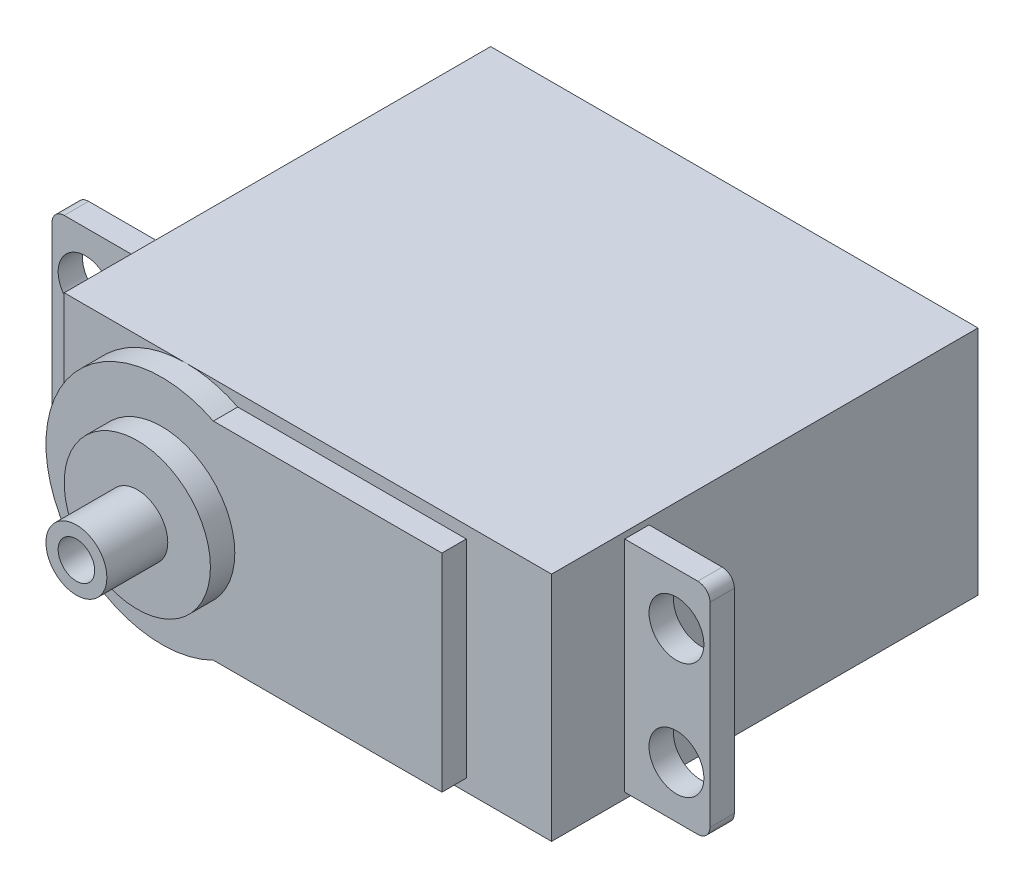
ISO-10303-21;
HEADER;
FILE_DESCRIPTION(('STEP AP214'),'2;1');
FILE_NAME('part.step','',(''),(''),'','','');
FILE_SCHEMA(('AUTOMOTIVE_DESIGN { 1 0 10303 214 1 1 1 1 }'));
ENDSEC;
DATA;
#1=APPLICATION_CONTEXT('core data for automotive mechanical design processes');
#2=APPLICATION_PROTOCOL_DEFINITION('international standard','automotive_design',2000,#1);
#3=PRODUCT_CONTEXT('',#1,'mechanical');
#4=PRODUCT('Part','Part','',(#3));
#5=PRODUCT_RELATED_PRODUCT_CATEGORY('part','',(#4));
#6=PRODUCT_DEFINITION_FORMATION('','',#4);
#7=PRODUCT_DEFINITION_CONTEXT('part definition',#1,'design');
#8=PRODUCT_DEFINITION('design','',#6,#7);
#9=PRODUCT_DEFINITION_SHAPE('','',#8);
#10=(LENGTH_UNIT() NAMED_UNIT(*) SI_UNIT(.MILLI.,.METRE.));
#11=(NAMED_UNIT(*) PLANE_ANGLE_UNIT() SI_UNIT($,.RADIAN.));
#12=(NAMED_UNIT(*) SI_UNIT($,.STERADIAN.) SOLID_ANGLE_UNIT());
#13=UNCERTAINTY_MEASURE_WITH_UNIT(LENGTH_MEASURE(1.E-05),#10,'distance_accuracy_value','');
#14=(GEOMETRIC_REPRESENTATION_CONTEXT(3) GLOBAL_UNCERTAINTY_ASSIGNED_CONTEXT((#13)) GLOBAL_UNIT_ASSIGNED_CONTEXT((#10,
#11,#12)) REPRESENTATION_CONTEXT('',''));
#15=CARTESIAN_POINT('',(0.,0.,0.));
#16=DIRECTION('',(0.,0.,1.));
#17=DIRECTION('',(1.,0.,0.));
#18=AXIS2_PLACEMENT_3D('',#15,#16,#17);
#19=CARTESIAN_POINT('',(-30.,9.50000000000001,39.));
#20=DIRECTION('',(0.,0.,-1.));
#21=DIRECTION('',(-1.,0.,0.));
#22=AXIS2_PLACEMENT_3D('',#19,#20,#21);
#23=PLANE('',#22);
#24=CARTESIAN_POINT('',(-30.,9.50000000000001,39.));
#25=DIRECTION('',(0.,0.,1.));
#26=DIRECTION('',(1.,0.,0.));
#27=AXIS2_PLACEMENT_3D('',#24,#25,#26);
#28=CIRCLE('',#27,6.);
#29=CARTESIAN_POINT('',(-24.,9.50000000000001,39.));
#30=VERTEX_POINT('',#29);
#31=EDGE_CURVE('P0_E20',#30,#30,#28,.F.);
#32=ORIENTED_EDGE('',*,*,#31,.F.);
#33=EDGE_LOOP('',(#32));
#34=FACE_BOUND('',#33,.T.);
#35=ADVANCED_FACE('P0_F17',(#34),#23,.F.);
#36=CARTESIAN_POINT('',(-30.,9.50000000000001,37.));
#37=DIRECTION('',(0.,0.,1.));
#38=DIRECTION('',(1.,0.,0.));
#39=AXIS2_PLACEMENT_3D('',#36,#37,#38);
#40=CYLINDRICAL_SURFACE('',#39,6.);
#41=CARTESIAN_POINT('',(-30.,9.50000000000001,37.));
#42=DIRECTION('',(0.,0.,1.));
#43=DIRECTION('',(1.,0.,0.));
#44=AXIS2_PLACEMENT_3D('',#41,#42,#43);
#45=CIRCLE('',#44,6.);
#46=CARTESIAN_POINT('',(-24.,9.50000000000001,37.));
#47=VERTEX_POINT('',#46);
#48=EDGE_CURVE('P0_E168',#47,#47,#45,.T.);
#49=ORIENTED_EDGE('',*,*,#48,.T.);
#50=EDGE_LOOP('',(#49));
#51=FACE_BOUND('',#50,.T.);
#52=ORIENTED_EDGE('',*,*,#31,.T.);
#53=EDGE_LOOP('',(#52));
#54=FACE_BOUND('',#53,.T.);
#55=ADVANCED_FACE('P0_F383',(#51,#54),#40,.T.);
#56=CARTESIAN_POINT('',(-30.,9.50000000000001,37.));
#57=DIRECTION('',(0.,0.,-1.));
#58=DIRECTION('',(-1.,0.,0.));
#59=AXIS2_PLACEMENT_3D('',#56,#57,#58);
#60=PLANE('',#59);
#61=ORIENTED_EDGE('',*,*,#48,.F.);
#62=EDGE_LOOP('',(#61));
#63=FACE_BOUND('',#62,.T.);
#64=DIRECTION('',(0.,1.,0.));
#65=VECTOR('',#64,1.);
#66=CARTESIAN_POINT('',(-7.00000000000001,18.,37.));
#67=LINE('',#66,#65);
#68=CARTESIAN_POINT('',(-7.00000000000001,18.,37.));
#69=VERTEX_POINT('',#68);
#70=CARTESIAN_POINT('',(-7.,1.,37.));
#71=VERTEX_POINT('',#70);
#72=EDGE_CURVE('P0_E227',#69,#71,#67,.F.);
#73=ORIENTED_EDGE('',*,*,#72,.F.);
#74=DIRECTION('',(-1.,0.,0.));
#75=VECTOR('',#74,1.);
#76=CARTESIAN_POINT('',(-30.,18.,37.));
#77=LINE('',#76,#75);
#78=CARTESIAN_POINT('',(-25.7573593128807,18.,37.));
#79=VERTEX_POINT('',#78);
#80=EDGE_CURVE('P0_E321',#79,#69,#77,.F.);
#81=ORIENTED_EDGE('',*,*,#80,.F.);
#82=CARTESIAN_POINT('',(-30.,9.50000000000001,37.));
#83=DIRECTION('',(0.,0.,1.));
#84=DIRECTION('',(1.,0.,0.));
#85=AXIS2_PLACEMENT_3D('',#82,#83,#84);
#86=CIRCLE('',#85,9.49999999999999);
#87=CARTESIAN_POINT('',(-25.7573593128808,0.999999999999986,37.));
#88=VERTEX_POINT('',#87);
#89=EDGE_CURVE('P0_E222',#88,#79,#86,.F.);
#90=ORIENTED_EDGE('',*,*,#89,.F.);
#91=DIRECTION('',(1.,0.,0.));
#92=VECTOR('',#91,1.);
#93=CARTESIAN_POINT('',(-7.,1.,37.));
#94=LINE('',#93,#92);
#95=EDGE_CURVE('P0_E277',#71,#88,#94,.F.);
#96=ORIENTED_EDGE('',*,*,#95,.F.);
#97=EDGE_LOOP('',(#73,#81,#90,#96));
#98=FACE_BOUND('',#97,.T.);
#99=ADVANCED_FACE('P0_F390',(#63,#98),#60,.F.);
#100=CARTESIAN_POINT('',(-46.,1.5,28.5));
#101=DIRECTION('',(0.,0.,-1.));
#102=DIRECTION('',(-1.,0.,0.));
#103=AXIS2_PLACEMENT_3D('',#100,#101,#102);
#104=CYLINDRICAL_SURFACE('',#103,1.);
#105=CARTESIAN_POINT('',(-46.,1.5,29.));
#106=DIRECTION('',(0.,0.,-1.));
#107=DIRECTION('',(-1.,0.,0.));
#108=AXIS2_PLACEMENT_3D('',#105,#106,#107);
#109=CIRCLE('',#108,1.);
#110=CARTESIAN_POINT('',(-47.,1.5,29.));
#111=VERTEX_POINT('',#110);
#112=CARTESIAN_POINT('',(-46.,0.499999999999996,29.));
#113=VERTEX_POINT('',#112);
#114=EDGE_CURVE('P0_E197',#111,#113,#109,.F.);
#115=ORIENTED_EDGE('',*,*,#114,.F.);
#116=DIRECTION('',(0.,0.,-1.));
#117=VECTOR('',#116,1.);
#118=CARTESIAN_POINT('',(-47.,1.5,28.));
#119=LINE('',#118,#117);
#120=CARTESIAN_POINT('',(-47.,1.5,27.));
#121=VERTEX_POINT('',#120);
#122=EDGE_CURVE('P0_E166',#111,#121,#119,.T.);
#123=ORIENTED_EDGE('',*,*,#122,.T.);
#124=CARTESIAN_POINT('',(-46.,1.5,27.));
#125=DIRECTION('',(0.,0.,-1.));
#126=DIRECTION('',(-1.,0.,0.));
#127=AXIS2_PLACEMENT_3D('',#124,#125,#126);
#128=CIRCLE('',#127,1.);
#129=CARTESIAN_POINT('',(-46.,0.499999999999996,27.));
#130=VERTEX_POINT('',#129);
#131=EDGE_CURVE('P0_E158',#121,#130,#128,.F.);
#132=ORIENTED_EDGE('',*,*,#131,.T.);
#133=DIRECTION('',(0.,0.,-1.));
#134=VECTOR('',#133,1.);
#135=CARTESIAN_POINT('',(-46.,0.499999999999996,29.));
#136=LINE('',#135,#134);
#137=EDGE_CURVE('P0_E164',#113,#130,#136,.T.);
#138=ORIENTED_EDGE('',*,*,#137,.F.);
#139=EDGE_LOOP('',(#115,#123,#132,#138));
#140=FACE_BOUND('',#139,.T.);
#141=ADVANCED_FACE('P0_F163',(#140),#104,.T.);
#142=CARTESIAN_POINT('',(-47.,9.5,28.));
#143=DIRECTION('',(1.,0.,0.));
#144=DIRECTION('',(0.,0.,-1.));
#145=AXIS2_PLACEMENT_3D('',#142,#143,#144);
#146=PLANE('',#145);
#147=DIRECTION('',(0.,1.,0.));
#148=VECTOR('',#147,1.);
#149=CARTESIAN_POINT('',(-47.,0.499999999999996,27.));
#150=LINE('',#149,#148);
#151=CARTESIAN_POINT('',(-47.,17.5,27.));
#152=VERTEX_POINT('',#151);
#153=EDGE_CURVE('P0_E183',#121,#152,#150,.T.);
#154=ORIENTED_EDGE('',*,*,#153,.F.);
#155=ORIENTED_EDGE('',*,*,#122,.F.);
#156=DIRECTION('',(0.,1.,0.));
#157=VECTOR('',#156,1.);
#158=CARTESIAN_POINT('',(-47.,18.5,29.));
#159=LINE('',#158,#157);
#160=CARTESIAN_POINT('',(-47.,17.5,29.));
#161=VERTEX_POINT('',#160);
#162=EDGE_CURVE('P0_E194',#161,#111,#159,.F.);
#163=ORIENTED_EDGE('',*,*,#162,.F.);
#164=DIRECTION('',(0.,0.,1.));
#165=VECTOR('',#164,1.);
#166=CARTESIAN_POINT('',(-47.,17.5,27.5));
#167=LINE('',#166,#165);
#168=EDGE_CURVE('P0_E312',#152,#161,#167,.T.);
#169=ORIENTED_EDGE('',*,*,#168,.F.);
#170=EDGE_LOOP('',(#154,#155,#163,#169));
#171=FACE_BOUND('',#170,.T.);
#172=ADVANCED_FACE('P0_F498',(#171),#146,.F.);
#173=CARTESIAN_POINT('',(-44.25,14.25,29.));
#174=DIRECTION('',(0.,0.,-1.));
#175=DIRECTION('',(-1.,0.,0.));
#176=AXIS2_PLACEMENT_3D('',#173,#174,#175);
#177=CYLINDRICAL_SURFACE('',#176,2.25);
#178=CARTESIAN_POINT('',(-44.25,14.25,29.));
#179=DIRECTION('',(0.,0.,-1.));
#180=DIRECTION('',(-1.,0.,0.));
#181=AXIS2_PLACEMENT_3D('',#178,#179,#180);
#182=CIRCLE('',#181,2.25);
#183=CARTESIAN_POINT('',(-46.5,14.25,29.));
#184=VERTEX_POINT('',#183);
#185=EDGE_CURVE('P0_E369',#184,#184,#182,.T.);
#186=ORIENTED_EDGE('',*,*,#185,.F.);
#187=EDGE_LOOP('',(#186));
#188=FACE_BOUND('',#187,.T.);
#189=CARTESIAN_POINT('',(-44.25,14.25,27.));
#190=DIRECTION('',(0.,0.,-1.));
#191=DIRECTION('',(-1.,0.,0.));
#192=AXIS2_PLACEMENT_3D('',#189,#190,#191);
#193=CIRCLE('',#192,2.25);
#194=CARTESIAN_POINT('',(-46.5,14.25,27.));
#195=VERTEX_POINT('',#194);
#196=EDGE_CURVE('P0_E186',#195,#195,#193,.F.);
#197=ORIENTED_EDGE('',*,*,#196,.F.);
#198=EDGE_LOOP('',(#197));
#199=FACE_BOUND('',#198,.T.);
#200=ADVANCED_FACE('P0_F494',(#188,#199),#177,.F.);
#201=CARTESIAN_POINT('',(-44.25,4.75,29.));
#202=DIRECTION('',(0.,0.,-1.));
#203=DIRECTION('',(-1.,0.,0.));
#204=AXIS2_PLACEMENT_3D('',#201,#202,#203);
#205=CYLINDRICAL_SURFACE('',#204,2.25);
#206=CARTESIAN_POINT('',(-44.25,4.75,29.));
#207=DIRECTION('',(0.,0.,-1.));
#208=DIRECTION('',(-1.,0.,0.));
#209=AXIS2_PLACEMENT_3D('',#206,#207,#208);
#210=CIRCLE('',#209,2.25);
#211=CARTESIAN_POINT('',(-46.5,4.75,29.));
#212=VERTEX_POINT('',#211);
#213=EDGE_CURVE('P0_E177',#212,#212,#210,.T.);
#214=ORIENTED_EDGE('',*,*,#213,.F.);
#215=EDGE_LOOP('',(#214));
#216=FACE_BOUND('',#215,.T.);
#217=CARTESIAN_POINT('',(-44.25,4.75,27.));
#218=DIRECTION('',(0.,0.,-1.));
#219=DIRECTION('',(-1.,0.,0.));
#220=AXIS2_PLACEMENT_3D('',#217,#218,#219);
#221=CIRCLE('',#220,2.25);
#222=CARTESIAN_POINT('',(-46.5,4.75,27.));
#223=VERTEX_POINT('',#222);
#224=EDGE_CURVE('P0_E287',#223,#223,#221,.F.);
#225=ORIENTED_EDGE('',*,*,#224,.F.);
#226=EDGE_LOOP('',(#225));
#227=FACE_BOUND('',#226,.T.);
#228=ADVANCED_FACE('P0_F490',(#216,#227),#205,.F.);
#229=CARTESIAN_POINT('',(-46.,17.5,27.5));
#230=DIRECTION('',(0.,0.,1.));
#231=DIRECTION('',(1.,0.,0.));
#232=AXIS2_PLACEMENT_3D('',#229,#230,#231);
#233=CYLINDRICAL_SURFACE('',#232,1.);
#234=CARTESIAN_POINT('',(-46.,17.5,27.));
#235=DIRECTION('',(0.,0.,1.));
#236=DIRECTION('',(1.,0.,0.));
#237=AXIS2_PLACEMENT_3D('',#234,#235,#236);
#238=CIRCLE('',#237,1.);
#239=CARTESIAN_POINT('',(-46.,18.5,27.));
#240=VERTEX_POINT('',#239);
#241=EDGE_CURVE('P0_E184',#152,#240,#238,.F.);
#242=ORIENTED_EDGE('',*,*,#241,.F.);
#243=ORIENTED_EDGE('',*,*,#168,.T.);
#244=CARTESIAN_POINT('',(-46.,17.5,29.));
#245=DIRECTION('',(0.,0.,1.));
#246=DIRECTION('',(1.,0.,0.));
#247=AXIS2_PLACEMENT_3D('',#244,#245,#246);
#248=CIRCLE('',#247,1.);
#249=CARTESIAN_POINT('',(-46.,18.5,29.));
#250=VERTEX_POINT('',#249);
#251=EDGE_CURVE('P0_E198',#250,#161,#248,.T.);
#252=ORIENTED_EDGE('',*,*,#251,.F.);
#253=DIRECTION('',(0.,0.,1.));
#254=VECTOR('',#253,1.);
#255=CARTESIAN_POINT('',(-46.,18.5,27.));
#256=LINE('',#255,#254);
#257=EDGE_CURVE('P0_E283',#240,#250,#256,.T.);
#258=ORIENTED_EDGE('',*,*,#257,.F.);
#259=EDGE_LOOP('',(#242,#243,#252,#258));
#260=FACE_BOUND('',#259,.T.);
#261=ADVANCED_FACE('P0_F486',(#260),#233,.T.);
#262=CARTESIAN_POINT('',(5.99999999999999,17.5,28.5));
#263=DIRECTION('',(0.,0.,-1.));
#264=DIRECTION('',(-1.,0.,0.));
#265=AXIS2_PLACEMENT_3D('',#262,#263,#264);
#266=CYLINDRICAL_SURFACE('',#265,1.);
#267=CARTESIAN_POINT('',(5.99999999999999,17.5,29.));
#268=DIRECTION('',(0.,0.,-1.));
#269=DIRECTION('',(-1.,0.,0.));
#270=AXIS2_PLACEMENT_3D('',#267,#268,#269);
#271=CIRCLE('',#270,1.);
#272=CARTESIAN_POINT('',(7.,17.5,29.));
#273=VERTEX_POINT('',#272);
#274=CARTESIAN_POINT('',(5.99999999999999,18.5,29.));
#275=VERTEX_POINT('',#274);
#276=EDGE_CURVE('P0_E357',#273,#275,#271,.F.);
#277=ORIENTED_EDGE('',*,*,#276,.F.);
#278=DIRECTION('',(0.,0.,1.));
#279=VECTOR('',#278,1.);
#280=CARTESIAN_POINT('',(7.,17.5,28.));
#281=LINE('',#280,#279);
#282=CARTESIAN_POINT('',(6.99999999999999,17.5,27.));
#283=VERTEX_POINT('',#282);
#284=EDGE_CURVE('P0_E263',#283,#273,#281,.T.);
#285=ORIENTED_EDGE('',*,*,#284,.F.);
#286=CARTESIAN_POINT('',(5.99999999999999,17.5,27.));
#287=DIRECTION('',(0.,0.,-1.));
#288=DIRECTION('',(-1.,0.,0.));
#289=AXIS2_PLACEMENT_3D('',#286,#287,#288);
#290=CIRCLE('',#289,1.);
#291=CARTESIAN_POINT('',(5.99999999999999,18.5,27.));
#292=VERTEX_POINT('',#291);
#293=EDGE_CURVE('P0_E266',#283,#292,#290,.F.);
#294=ORIENTED_EDGE('',*,*,#293,.T.);
#295=DIRECTION('',(0.,0.,1.));
#296=VECTOR('',#295,1.);
#297=CARTESIAN_POINT('',(5.99999999999999,18.5,29.));
#298=LINE('',#297,#296);
#299=EDGE_CURVE('P0_E267',#275,#292,#298,.F.);
#300=ORIENTED_EDGE('',*,*,#299,.F.);
#301=EDGE_LOOP('',(#277,#285,#294,#300));
#302=FACE_BOUND('',#301,.T.);
#303=ADVANCED_FACE('P0_F482',(#302),#266,.T.);
#304=CARTESIAN_POINT('',(7.,9.50000000000001,28.));
#305=DIRECTION('',(1.,0.,0.));
#306=DIRECTION('',(0.,1.,0.));
#307=AXIS2_PLACEMENT_3D('',#304,#305,#306);
#308=PLANE('',#307);
#309=ORIENTED_EDGE('',*,*,#284,.T.);
#310=DIRECTION('',(0.,1.,0.));
#311=VECTOR('',#310,1.);
#312=CARTESIAN_POINT('',(7.,0.5,29.));
#313=LINE('',#312,#311);
#314=CARTESIAN_POINT('',(7.,1.5,29.));
#315=VERTEX_POINT('',#314);
#316=EDGE_CURVE('P0_E360',#315,#273,#313,.T.);
#317=ORIENTED_EDGE('',*,*,#316,.F.);
#318=DIRECTION('',(0.,0.,1.));
#319=VECTOR('',#318,1.);
#320=CARTESIAN_POINT('',(7.,1.5,27.5));
#321=LINE('',#320,#319);
#322=CARTESIAN_POINT('',(7.,1.5,27.));
#323=VERTEX_POINT('',#322);
#324=EDGE_CURVE('P0_E265',#323,#315,#321,.T.);
#325=ORIENTED_EDGE('',*,*,#324,.F.);
#326=DIRECTION('',(0.,1.,0.));
#327=VECTOR('',#326,1.);
#328=CARTESIAN_POINT('',(6.99999999999999,18.5,27.));
#329=LINE('',#328,#327);
#330=EDGE_CURVE('P0_E348',#283,#323,#329,.F.);
#331=ORIENTED_EDGE('',*,*,#330,.F.);
#332=EDGE_LOOP('',(#309,#317,#325,#331));
#333=FACE_BOUND('',#332,.T.);
#334=ADVANCED_FACE('P0_F478',(#333),#308,.T.);
#335=CARTESIAN_POINT('',(4.24999999999999,14.25,29.));
#336=DIRECTION('',(0.,0.,-1.));
#337=DIRECTION('',(-1.,0.,0.));
#338=AXIS2_PLACEMENT_3D('',#335,#336,#337);
#339=CYLINDRICAL_SURFACE('',#338,2.25);
#340=CARTESIAN_POINT('',(4.24999999999999,14.25,29.));
#341=DIRECTION('',(0.,0.,-1.));
#342=DIRECTION('',(-1.,0.,0.));
#343=AXIS2_PLACEMENT_3D('',#340,#341,#342);
#344=CIRCLE('',#343,2.25);
#345=CARTESIAN_POINT('',(1.99999999999999,14.25,29.));
#346=VERTEX_POINT('',#345);
#347=EDGE_CURVE('P0_E354',#346,#346,#344,.T.);
#348=ORIENTED_EDGE('',*,*,#347,.F.);
#349=EDGE_LOOP('',(#348));
#350=FACE_BOUND('',#349,.T.);
#351=CARTESIAN_POINT('',(4.24999999999999,14.25,27.));
#352=DIRECTION('',(0.,0.,-1.));
#353=DIRECTION('',(-1.,0.,0.));
#354=AXIS2_PLACEMENT_3D('',#351,#352,#353);
#355=CIRCLE('',#354,2.25);
#356=CARTESIAN_POINT('',(1.99999999999999,14.25,27.));
#357=VERTEX_POINT('',#356);
#358=EDGE_CURVE('P0_E345',#357,#357,#355,.F.);
#359=ORIENTED_EDGE('',*,*,#358,.F.);
#360=EDGE_LOOP('',(#359));
#361=FACE_BOUND('',#360,.T.);
#362=ADVANCED_FACE('P0_F474',(#350,#361),#339,.F.);
#363=CARTESIAN_POINT('',(4.25,4.75,29.));
#364=DIRECTION('',(0.,0.,-1.));
#365=DIRECTION('',(-1.,0.,0.));
#366=AXIS2_PLACEMENT_3D('',#363,#364,#365);
#367=CYLINDRICAL_SURFACE('',#366,2.25);
#368=CARTESIAN_POINT('',(4.25,4.75,29.));
#369=DIRECTION('',(0.,0.,-1.));
#370=DIRECTION('',(-1.,0.,0.));
#371=AXIS2_PLACEMENT_3D('',#368,#369,#370);
#372=CIRCLE('',#371,2.25);
#373=CARTESIAN_POINT('',(2.,4.75,29.));
#374=VERTEX_POINT('',#373);
#375=EDGE_CURVE('P0_E271',#374,#374,#372,.T.);
#376=ORIENTED_EDGE('',*,*,#375,.F.);
#377=EDGE_LOOP('',(#376));
#378=FACE_BOUND('',#377,.T.);
#379=CARTESIAN_POINT('',(4.25,4.75,27.));
#380=DIRECTION('',(0.,0.,-1.));
#381=DIRECTION('',(-1.,0.,0.));
#382=AXIS2_PLACEMENT_3D('',#379,#380,#381);
#383=CIRCLE('',#382,2.25);
#384=CARTESIAN_POINT('',(2.,4.75,27.));
#385=VERTEX_POINT('',#384);
#386=EDGE_CURVE('P0_E234',#385,#385,#383,.F.);
#387=ORIENTED_EDGE('',*,*,#386,.F.);
#388=EDGE_LOOP('',(#387));
#389=FACE_BOUND('',#388,.T.);
#390=ADVANCED_FACE('P0_F470',(#378,#389),#367,.F.);
#391=CARTESIAN_POINT('',(6.,1.5,27.5));
#392=DIRECTION('',(0.,0.,1.));
#393=DIRECTION('',(1.,0.,0.));
#394=AXIS2_PLACEMENT_3D('',#391,#392,#393);
#395=CYLINDRICAL_SURFACE('',#394,1.);
#396=CARTESIAN_POINT('',(6.,1.5,27.));
#397=DIRECTION('',(0.,0.,1.));
#398=DIRECTION('',(1.,0.,0.));
#399=AXIS2_PLACEMENT_3D('',#396,#397,#398);
#400=CIRCLE('',#399,1.);
#401=CARTESIAN_POINT('',(6.,0.500000000000003,27.));
#402=VERTEX_POINT('',#401);
#403=EDGE_CURVE('P0_E280',#323,#402,#400,.F.);
#404=ORIENTED_EDGE('',*,*,#403,.F.);
#405=ORIENTED_EDGE('',*,*,#324,.T.);
#406=CARTESIAN_POINT('',(6.,1.5,29.));
#407=DIRECTION('',(0.,0.,1.));
#408=DIRECTION('',(1.,0.,0.));
#409=AXIS2_PLACEMENT_3D('',#406,#407,#408);
#410=CIRCLE('',#409,1.);
#411=CARTESIAN_POINT('',(6.,0.500000000000003,29.));
#412=VERTEX_POINT('',#411);
#413=EDGE_CURVE('P0_E291',#412,#315,#410,.T.);
#414=ORIENTED_EDGE('',*,*,#413,.F.);
#415=DIRECTION('',(0.,0.,1.));
#416=VECTOR('',#415,1.);
#417=CARTESIAN_POINT('',(6.,0.500000000000003,27.));
#418=LINE('',#417,#416);
#419=EDGE_CURVE('P0_E230',#402,#412,#418,.T.);
#420=ORIENTED_EDGE('',*,*,#419,.F.);
#421=EDGE_LOOP('',(#404,#405,#414,#420));
#422=FACE_BOUND('',#421,.T.);
#423=ADVANCED_FACE('P0_F466',(#422),#395,.T.);
#424=CARTESIAN_POINT('',(-7.,1.,35.));
#425=DIRECTION('',(0.,-1.,0.));
#426=DIRECTION('',(1.,0.,0.));
#427=AXIS2_PLACEMENT_3D('',#424,#425,#426);
#428=PLANE('',#427);
#429=DIRECTION('',(0.,0.,1.));
#430=VECTOR('',#429,1.);
#431=CARTESIAN_POINT('',(-7.,1.,35.));
#432=LINE('',#431,#430);
#433=CARTESIAN_POINT('',(-7.00000000000001,1.,35.));
#434=VERTEX_POINT('',#433);
#435=EDGE_CURVE('P0_E217',#71,#434,#432,.F.);
#436=ORIENTED_EDGE('',*,*,#435,.F.);
#437=ORIENTED_EDGE('',*,*,#95,.T.);
#438=DIRECTION('',(0.,0.,1.));
#439=VECTOR('',#438,1.);
#440=CARTESIAN_POINT('',(-25.7573593128808,0.999999999999982,35.));
#441=LINE('',#440,#439);
#442=CARTESIAN_POINT('',(-25.7573593128808,0.99999999999999,35.));
#443=VERTEX_POINT('',#442);
#444=EDGE_CURVE('P0_E216',#443,#88,#441,.T.);
#445=ORIENTED_EDGE('',*,*,#444,.F.);
#446=DIRECTION('',(1.,0.,0.));
#447=VECTOR('',#446,1.);
#448=CARTESIAN_POINT('',(-20.,0.999999999999999,35.));
#449=LINE('',#448,#447);
#450=EDGE_CURVE('P0_E238',#434,#443,#449,.F.);
#451=ORIENTED_EDGE('',*,*,#450,.F.);
#452=EDGE_LOOP('',(#436,#437,#445,#451));
#453=FACE_BOUND('',#452,.T.);
#454=ADVANCED_FACE('P0_F462',(#453),#428,.T.);
#455=CARTESIAN_POINT('',(-30.,18.,35.));
#456=DIRECTION('',(0.,1.,0.));
#457=DIRECTION('',(-1.,0.,0.));
#458=AXIS2_PLACEMENT_3D('',#455,#456,#457);
#459=PLANE('',#458);
#460=DIRECTION('',(0.,0.,1.));
#461=VECTOR('',#460,1.);
#462=CARTESIAN_POINT('',(-7.00000000000001,18.,35.));
#463=LINE('',#462,#461);
#464=CARTESIAN_POINT('',(-7.00000000000001,18.,35.));
#465=VERTEX_POINT('',#464);
#466=EDGE_CURVE('P0_E213',#465,#69,#463,.T.);
#467=ORIENTED_EDGE('',*,*,#466,.F.);
#468=DIRECTION('',(1.,0.,0.));
#469=VECTOR('',#468,1.);
#470=CARTESIAN_POINT('',(-20.,18.,35.));
#471=LINE('',#470,#469);
#472=CARTESIAN_POINT('',(-25.7573593128807,18.,35.));
#473=VERTEX_POINT('',#472);
#474=EDGE_CURVE('P0_E210',#473,#465,#471,.T.);
#475=ORIENTED_EDGE('',*,*,#474,.F.);
#476=DIRECTION('',(0.,0.,1.));
#477=VECTOR('',#476,1.);
#478=CARTESIAN_POINT('',(-25.7573593128807,18.,35.));
#479=LINE('',#478,#477);
#480=EDGE_CURVE('P0_E220',#79,#473,#479,.F.);
#481=ORIENTED_EDGE('',*,*,#480,.F.);
#482=ORIENTED_EDGE('',*,*,#80,.T.);
#483=EDGE_LOOP('',(#467,#475,#481,#482));
#484=FACE_BOUND('',#483,.T.);
#485=ADVANCED_FACE('P0_F458',(#484),#459,.T.);
#486=CARTESIAN_POINT('',(-7.00000000000001,18.,35.));
#487=DIRECTION('',(1.,0.,0.));
#488=DIRECTION('',(0.,1.,0.));
#489=AXIS2_PLACEMENT_3D('',#486,#487,#488);
#490=PLANE('',#489);
#491=DIRECTION('',(0.,1.,0.));
#492=VECTOR('',#491,1.);
#493=CARTESIAN_POINT('',(-7.00000000000001,9.5,35.));
#494=LINE('',#493,#492);
#495=EDGE_CURVE('P0_E206',#465,#434,#494,.F.);
#496=ORIENTED_EDGE('',*,*,#495,.F.);
#497=ORIENTED_EDGE('',*,*,#466,.T.);
#498=ORIENTED_EDGE('',*,*,#72,.T.);
#499=ORIENTED_EDGE('',*,*,#435,.T.);
#500=EDGE_LOOP('',(#496,#497,#498,#499));
#501=FACE_BOUND('',#500,.T.);
#502=ADVANCED_FACE('P0_F454',(#501),#490,.T.);
#503=CARTESIAN_POINT('',(-30.,9.50000000000001,35.));
#504=DIRECTION('',(0.,0.,1.));
#505=DIRECTION('',(1.,0.,0.));
#506=AXIS2_PLACEMENT_3D('',#503,#504,#505);
#507=CYLINDRICAL_SURFACE('',#506,9.49999999999999);
#508=CARTESIAN_POINT('',(-30.,9.50000000000001,35.));
#509=DIRECTION('',(0.,0.,1.));
#510=DIRECTION('',(1.,0.,0.));
#511=AXIS2_PLACEMENT_3D('',#508,#509,#510);
#512=CIRCLE('',#511,9.49999999999999);
#513=CARTESIAN_POINT('',(-30.,0.,35.));
#514=VERTEX_POINT('',#513);
#515=CARTESIAN_POINT('',(-30.,19.,35.));
#516=VERTEX_POINT('',#515);
#517=EDGE_CURVE('P0_E209',#514,#516,#512,.F.);
#518=ORIENTED_EDGE('',*,*,#517,.F.);
#519=CARTESIAN_POINT('',(-30.,9.50000000000001,35.));
#520=DIRECTION('',(0.,0.,1.));
#521=DIRECTION('',(1.,0.,0.));
#522=AXIS2_PLACEMENT_3D('',#519,#520,#521);
#523=CIRCLE('',#522,9.49999999999999);
#524=EDGE_CURVE('P0_E340',#443,#514,#523,.F.);
#525=ORIENTED_EDGE('',*,*,#524,.F.);
#526=ORIENTED_EDGE('',*,*,#444,.T.);
#527=ORIENTED_EDGE('',*,*,#89,.T.);
#528=ORIENTED_EDGE('',*,*,#480,.T.);
#529=CARTESIAN_POINT('',(-30.,9.50000000000001,35.));
#530=DIRECTION('',(0.,0.,1.));
#531=DIRECTION('',(1.,0.,0.));
#532=AXIS2_PLACEMENT_3D('',#529,#530,#531);
#533=CIRCLE('',#532,9.49999999999999);
#534=EDGE_CURVE('P0_E336',#516,#473,#533,.F.);
#535=ORIENTED_EDGE('',*,*,#534,.F.);
#536=EDGE_LOOP('',(#518,#525,#526,#527,#528,#535));
#537=FACE_BOUND('',#536,.T.);
#538=ADVANCED_FACE('P0_F450',(#537),#507,.T.);
#539=CARTESIAN_POINT('',(-40.,18.5,29.));
#540=DIRECTION('',(0.,0.,1.));
#541=DIRECTION('',(1.,0.,0.));
#542=AXIS2_PLACEMENT_3D('',#539,#540,#541);
#543=PLANE('',#542);
#544=ORIENTED_EDGE('',*,*,#213,.T.);
#545=EDGE_LOOP('',(#544));
#546=FACE_BOUND('',#545,.T.);
#547=ORIENTED_EDGE('',*,*,#185,.T.);
#548=EDGE_LOOP('',(#547));
#549=FACE_BOUND('',#548,.T.);
#550=DIRECTION('',(0.,1.,0.));
#551=VECTOR('',#550,1.);
#552=CARTESIAN_POINT('',(-40.,0.,29.));
#553=LINE('',#552,#551);
#554=CARTESIAN_POINT('',(-40.,18.5,29.));
#555=VERTEX_POINT('',#554);
#556=CARTESIAN_POINT('',(-40.,0.499999999999996,29.));
#557=VERTEX_POINT('',#556);
#558=EDGE_CURVE('P0_E202',#555,#557,#553,.F.);
#559=ORIENTED_EDGE('',*,*,#558,.F.);
#560=DIRECTION('',(1.,0.,0.));
#561=VECTOR('',#560,1.);
#562=CARTESIAN_POINT('',(-40.,18.5,29.));
#563=LINE('',#562,#561);
#564=EDGE_CURVE('P0_E286',#250,#555,#563,.T.);
#565=ORIENTED_EDGE('',*,*,#564,.F.);
#566=ORIENTED_EDGE('',*,*,#251,.T.);
#567=ORIENTED_EDGE('',*,*,#162,.T.);
#568=ORIENTED_EDGE('',*,*,#114,.T.);
#569=DIRECTION('',(1.,0.,0.));
#570=VECTOR('',#569,1.);
#571=CARTESIAN_POINT('',(-40.,0.499999999999996,29.));
#572=LINE('',#571,#570);
#573=EDGE_CURVE('P0_E176',#557,#113,#572,.F.);
#574=ORIENTED_EDGE('',*,*,#573,.F.);
#575=EDGE_LOOP('',(#559,#565,#566,#567,#568,#574));
#576=FACE_BOUND('',#575,.T.);
#577=ADVANCED_FACE('P0_F447',(#546,#549,#576),#543,.T.);
#578=CARTESIAN_POINT('',(-40.,0.499999999999996,29.));
#579=DIRECTION('',(0.,-1.,0.));
#580=DIRECTION('',(0.,0.,-1.));
#581=AXIS2_PLACEMENT_3D('',#578,#579,#580);
#582=PLANE('',#581);
#583=DIRECTION('',(0.,0.,1.));
#584=VECTOR('',#583,1.);
#585=CARTESIAN_POINT('',(-40.,0.499999999999996,0.));
#586=LINE('',#585,#584);
#587=CARTESIAN_POINT('',(-40.,0.499999999999996,27.));
#588=VERTEX_POINT('',#587);
#589=EDGE_CURVE('P0_E301',#557,#588,#586,.F.);
#590=ORIENTED_EDGE('',*,*,#589,.F.);
#591=ORIENTED_EDGE('',*,*,#573,.T.);
#592=ORIENTED_EDGE('',*,*,#137,.T.);
#593=DIRECTION('',(-1.,0.,0.));
#594=VECTOR('',#593,1.);
#595=CARTESIAN_POINT('',(-40.,0.499999999999996,27.));
#596=LINE('',#595,#594);
#597=EDGE_CURVE('P0_E174',#588,#130,#596,.T.);
#598=ORIENTED_EDGE('',*,*,#597,.F.);
#599=EDGE_LOOP('',(#590,#591,#592,#598));
#600=FACE_BOUND('',#599,.T.);
#601=ADVANCED_FACE('P0_F173',(#600),#582,.T.);
#602=CARTESIAN_POINT('',(-40.,0.499999999999996,27.));
#603=DIRECTION('',(0.,0.,-1.));
#604=DIRECTION('',(-1.,0.,0.));
#605=AXIS2_PLACEMENT_3D('',#602,#603,#604);
#606=PLANE('',#605);
#607=ORIENTED_EDGE('',*,*,#224,.T.);
#608=EDGE_LOOP('',(#607));
#609=FACE_BOUND('',#608,.T.);
#610=ORIENTED_EDGE('',*,*,#196,.T.);
#611=EDGE_LOOP('',(#610));
#612=FACE_BOUND('',#611,.T.);
#613=ORIENTED_EDGE('',*,*,#131,.F.);
#614=ORIENTED_EDGE('',*,*,#153,.T.);
#615=ORIENTED_EDGE('',*,*,#241,.T.);
#616=DIRECTION('',(1.,0.,0.));
#617=VECTOR('',#616,1.);
#618=CARTESIAN_POINT('',(-40.,18.5,27.));
#619=LINE('',#618,#617);
#620=CARTESIAN_POINT('',(-40.,18.5,27.));
#621=VERTEX_POINT('',#620);
#622=EDGE_CURVE('P0_E288',#621,#240,#619,.F.);
#623=ORIENTED_EDGE('',*,*,#622,.F.);
#624=DIRECTION('',(0.,1.,0.));
#625=VECTOR('',#624,1.);
#626=CARTESIAN_POINT('',(-40.,0.,27.));
#627=LINE('',#626,#625);
#628=EDGE_CURVE('P0_E181',#588,#621,#627,.T.);
#629=ORIENTED_EDGE('',*,*,#628,.F.);
#630=ORIENTED_EDGE('',*,*,#597,.T.);
#631=EDGE_LOOP('',(#613,#614,#615,#623,#629,#630));
#632=FACE_BOUND('',#631,.T.);
#633=ADVANCED_FACE('P0_F179',(#609,#612,#632),#606,.T.);
#634=CARTESIAN_POINT('',(-40.,18.5,27.));
#635=DIRECTION('',(0.,1.,0.));
#636=DIRECTION('',(0.,0.,1.));
#637=AXIS2_PLACEMENT_3D('',#634,#635,#636);
#638=PLANE('',#637);
#639=DIRECTION('',(0.,0.,1.));
#640=VECTOR('',#639,1.);
#641=CARTESIAN_POINT('',(-40.,18.5,0.));
#642=LINE('',#641,#640);
#643=EDGE_CURVE('P0_E294',#621,#555,#642,.T.);
#644=ORIENTED_EDGE('',*,*,#643,.F.);
#645=ORIENTED_EDGE('',*,*,#622,.T.);
#646=ORIENTED_EDGE('',*,*,#257,.T.);
#647=ORIENTED_EDGE('',*,*,#564,.T.);
#648=EDGE_LOOP('',(#644,#645,#646,#647));
#649=FACE_BOUND('',#648,.T.);
#650=ADVANCED_FACE('P0_F437',(#649),#638,.T.);
#651=CARTESIAN_POINT('',(-40.,19.,0.));
#652=DIRECTION('',(0.,1.,0.));
#653=DIRECTION('',(-1.,0.,0.));
#654=AXIS2_PLACEMENT_3D('',#651,#652,#653);
#655=PLANE('',#654);
#656=DIRECTION('',(1.,0.,0.));
#657=VECTOR('',#656,1.);
#658=CARTESIAN_POINT('',(-20.,19.,0.));
#659=LINE('',#658,#657);
#660=CARTESIAN_POINT('',(0.,19.,0.));
#661=VERTEX_POINT('',#660);
#662=CARTESIAN_POINT('',(-40.,19.,0.));
#663=VERTEX_POINT('',#662);
#664=EDGE_CURVE('P0_E297',#661,#663,#659,.F.);
#665=ORIENTED_EDGE('',*,*,#664,.T.);
#666=DIRECTION('',(0.,0.,1.));
#667=VECTOR('',#666,1.);
#668=CARTESIAN_POINT('',(-40.,19.,0.));
#669=LINE('',#668,#667);
#670=CARTESIAN_POINT('',(-40.,19.,35.));
#671=VERTEX_POINT('',#670);
#672=EDGE_CURVE('P0_E199',#671,#663,#669,.F.);
#673=ORIENTED_EDGE('',*,*,#672,.F.);
#674=DIRECTION('',(1.,0.,0.));
#675=VECTOR('',#674,1.);
#676=CARTESIAN_POINT('',(-20.,19.,35.));
#677=LINE('',#676,#675);
#678=EDGE_CURVE('P0_E335',#516,#671,#677,.F.);
#679=ORIENTED_EDGE('',*,*,#678,.F.);
#680=DIRECTION('',(1.,0.,0.));
#681=VECTOR('',#680,1.);
#682=CARTESIAN_POINT('',(-20.,19.,35.));
#683=LINE('',#682,#681);
#684=CARTESIAN_POINT('',(0.,19.,35.));
#685=VERTEX_POINT('',#684);
#686=EDGE_CURVE('P0_E339',#685,#516,#683,.F.);
#687=ORIENTED_EDGE('',*,*,#686,.F.);
#688=DIRECTION('',(0.,0.,1.));
#689=VECTOR('',#688,1.);
#690=CARTESIAN_POINT('',(0.,19.,0.));
#691=LINE('',#690,#689);
#692=EDGE_CURVE('P0_E260',#661,#685,#691,.T.);
#693=ORIENTED_EDGE('',*,*,#692,.F.);
#694=EDGE_LOOP('',(#665,#673,#679,#687,#693));
#695=FACE_BOUND('',#694,.T.);
#696=ADVANCED_FACE('P0_F433',(#695),#655,.T.);
#697=CARTESIAN_POINT('',(0.,0.5,29.));
#698=DIRECTION('',(0.,0.,1.));
#699=DIRECTION('',(1.,0.,0.));
#700=AXIS2_PLACEMENT_3D('',#697,#698,#699);
#701=PLANE('',#700);
#702=ORIENTED_EDGE('',*,*,#375,.T.);
#703=EDGE_LOOP('',(#702));
#704=FACE_BOUND('',#703,.T.);
#705=ORIENTED_EDGE('',*,*,#347,.T.);
#706=EDGE_LOOP('',(#705));
#707=FACE_BOUND('',#706,.T.);
#708=DIRECTION('',(0.,1.,0.));
#709=VECTOR('',#708,1.);
#710=CARTESIAN_POINT('',(0.,19.,29.));
#711=LINE('',#710,#709);
#712=CARTESIAN_POINT('',(0.,0.5,29.));
#713=VERTEX_POINT('',#712);
#714=CARTESIAN_POINT('',(0.,18.5,29.));
#715=VERTEX_POINT('',#714);
#716=EDGE_CURVE('P0_E257',#713,#715,#711,.T.);
#717=ORIENTED_EDGE('',*,*,#716,.F.);
#718=DIRECTION('',(1.,0.,0.));
#719=VECTOR('',#718,1.);
#720=CARTESIAN_POINT('',(0.,0.5,29.));
#721=LINE('',#720,#719);
#722=EDGE_CURVE('P0_E233',#412,#713,#721,.F.);
#723=ORIENTED_EDGE('',*,*,#722,.F.);
#724=ORIENTED_EDGE('',*,*,#413,.T.);
#725=ORIENTED_EDGE('',*,*,#316,.T.);
#726=ORIENTED_EDGE('',*,*,#276,.T.);
#727=DIRECTION('',(-1.,0.,0.));
#728=VECTOR('',#727,1.);
#729=CARTESIAN_POINT('',(0.,18.5,29.));
#730=LINE('',#729,#728);
#731=EDGE_CURVE('P0_E270',#715,#275,#730,.F.);
#732=ORIENTED_EDGE('',*,*,#731,.F.);
#733=EDGE_LOOP('',(#717,#723,#724,#725,#726,#732));
#734=FACE_BOUND('',#733,.T.);
#735=ADVANCED_FACE('P0_F429',(#704,#707,#734),#701,.T.);
#736=CARTESIAN_POINT('',(0.,18.5,29.));
#737=DIRECTION('',(0.,1.,0.));
#738=DIRECTION('',(-1.,0.,0.));
#739=AXIS2_PLACEMENT_3D('',#736,#737,#738);
#740=PLANE('',#739);
#741=DIRECTION('',(0.,0.,1.));
#742=VECTOR('',#741,1.);
#743=CARTESIAN_POINT('',(0.,18.5,0.));
#744=LINE('',#743,#742);
#745=CARTESIAN_POINT('',(0.,18.5,27.));
#746=VERTEX_POINT('',#745);
#747=EDGE_CURVE('P0_E250',#715,#746,#744,.F.);
#748=ORIENTED_EDGE('',*,*,#747,.F.);
#749=ORIENTED_EDGE('',*,*,#731,.T.);
#750=ORIENTED_EDGE('',*,*,#299,.T.);
#751=DIRECTION('',(-1.,0.,0.));
#752=VECTOR('',#751,1.);
#753=CARTESIAN_POINT('',(0.,18.5,27.));
#754=LINE('',#753,#752);
#755=EDGE_CURVE('P0_E351',#746,#292,#754,.F.);
#756=ORIENTED_EDGE('',*,*,#755,.F.);
#757=EDGE_LOOP('',(#748,#749,#750,#756));
#758=FACE_BOUND('',#757,.T.);
#759=ADVANCED_FACE('P0_F425',(#758),#740,.T.);
#760=CARTESIAN_POINT('',(0.,18.5,27.));
#761=DIRECTION('',(0.,0.,-1.));
#762=DIRECTION('',(-1.,0.,0.));
#763=AXIS2_PLACEMENT_3D('',#760,#761,#762);
#764=PLANE('',#763);
#765=ORIENTED_EDGE('',*,*,#386,.T.);
#766=EDGE_LOOP('',(#765));
#767=FACE_BOUND('',#766,.T.);
#768=ORIENTED_EDGE('',*,*,#358,.T.);
#769=EDGE_LOOP('',(#768));
#770=FACE_BOUND('',#769,.T.);
#771=ORIENTED_EDGE('',*,*,#293,.F.);
#772=ORIENTED_EDGE('',*,*,#330,.T.);
#773=ORIENTED_EDGE('',*,*,#403,.T.);
#774=DIRECTION('',(1.,0.,0.));
#775=VECTOR('',#774,1.);
#776=CARTESIAN_POINT('',(0.,0.5,27.));
#777=LINE('',#776,#775);
#778=CARTESIAN_POINT('',(0.,0.5,27.));
#779=VERTEX_POINT('',#778);
#780=EDGE_CURVE('P0_E235',#779,#402,#777,.T.);
#781=ORIENTED_EDGE('',*,*,#780,.F.);
#782=DIRECTION('',(0.,1.,0.));
#783=VECTOR('',#782,1.);
#784=CARTESIAN_POINT('',(0.,19.,27.));
#785=LINE('',#784,#783);
#786=EDGE_CURVE('P0_E245',#746,#779,#785,.F.);
#787=ORIENTED_EDGE('',*,*,#786,.F.);
#788=ORIENTED_EDGE('',*,*,#755,.T.);
#789=EDGE_LOOP('',(#771,#772,#773,#781,#787,#788));
#790=FACE_BOUND('',#789,.T.);
#791=ADVANCED_FACE('P0_F421',(#767,#770,#790),#764,.T.);
#792=CARTESIAN_POINT('',(0.,0.5,27.));
#793=DIRECTION('',(0.,-1.,0.));
#794=DIRECTION('',(1.,0.,0.));
#795=AXIS2_PLACEMENT_3D('',#792,#793,#794);
#796=PLANE('',#795);
#797=DIRECTION('',(0.,0.,1.));
#798=VECTOR('',#797,1.);
#799=CARTESIAN_POINT('',(0.,0.5,0.));
#800=LINE('',#799,#798);
#801=EDGE_CURVE('P0_E241',#779,#713,#800,.T.);
#802=ORIENTED_EDGE('',*,*,#801,.F.);
#803=ORIENTED_EDGE('',*,*,#780,.T.);
#804=ORIENTED_EDGE('',*,*,#419,.T.);
#805=ORIENTED_EDGE('',*,*,#722,.T.);
#806=EDGE_LOOP('',(#802,#803,#804,#805));
#807=FACE_BOUND('',#806,.T.);
#808=ADVANCED_FACE('P0_F417',(#807),#796,.T.);
#809=CARTESIAN_POINT('',(-20.,9.5,35.));
#810=DIRECTION('',(0.,0.,1.));
#811=DIRECTION('',(1.,0.,0.));
#812=AXIS2_PLACEMENT_3D('',#809,#810,#811);
#813=PLANE('',#812);
#814=ORIENTED_EDGE('',*,*,#474,.T.);
#815=ORIENTED_EDGE('',*,*,#495,.T.);
#816=ORIENTED_EDGE('',*,*,#450,.T.);
#817=ORIENTED_EDGE('',*,*,#524,.T.);
#818=DIRECTION('',(1.,0.,0.));
#819=VECTOR('',#818,1.);
#820=CARTESIAN_POINT('',(0.,0.,35.));
#821=LINE('',#820,#819);
#822=CARTESIAN_POINT('',(0.,0.,35.));
#823=VERTEX_POINT('',#822);
#824=EDGE_CURVE('P0_E244',#823,#514,#821,.F.);
#825=ORIENTED_EDGE('',*,*,#824,.F.);
#826=DIRECTION('',(0.,1.,0.));
#827=VECTOR('',#826,1.);
#828=CARTESIAN_POINT('',(0.,19.,35.));
#829=LINE('',#828,#827);
#830=EDGE_CURVE('P0_E531',#685,#823,#829,.F.);
#831=ORIENTED_EDGE('',*,*,#830,.F.);
#832=ORIENTED_EDGE('',*,*,#686,.T.);
#833=ORIENTED_EDGE('',*,*,#534,.T.);
#834=EDGE_LOOP('',(#814,#815,#816,#817,#825,#831,#832,#833));
#835=FACE_BOUND('',#834,.T.);
#836=ADVANCED_FACE('P0_F413',(#835),#813,.T.);
#837=CARTESIAN_POINT('',(-20.,9.5,35.));
#838=DIRECTION('',(0.,0.,1.));
#839=DIRECTION('',(1.,0.,0.));
#840=AXIS2_PLACEMENT_3D('',#837,#838,#839);
#841=PLANE('',#840);
#842=DIRECTION('',(0.,1.,0.));
#843=VECTOR('',#842,1.);
#844=CARTESIAN_POINT('',(-40.,0.,35.));
#845=LINE('',#844,#843);
#846=CARTESIAN_POINT('',(-40.,0.,35.));
#847=VERTEX_POINT('',#846);
#848=EDGE_CURVE('P0_E203',#847,#671,#845,.T.);
#849=ORIENTED_EDGE('',*,*,#848,.F.);
#850=DIRECTION('',(1.,0.,0.));
#851=VECTOR('',#850,1.);
#852=CARTESIAN_POINT('',(0.,0.,35.));
#853=LINE('',#852,#851);
#854=EDGE_CURVE('P0_E561',#514,#847,#853,.F.);
#855=ORIENTED_EDGE('',*,*,#854,.F.);
#856=ORIENTED_EDGE('',*,*,#517,.T.);
#857=ORIENTED_EDGE('',*,*,#678,.T.);
#858=EDGE_LOOP('',(#849,#855,#856,#857));
#859=FACE_BOUND('',#858,.T.);
#860=ADVANCED_FACE('P0_F409',(#859),#841,.T.);
#861=CARTESIAN_POINT('',(-40.,0.,0.));
#862=DIRECTION('',(-1.,0.,0.));
#863=DIRECTION('',(0.,0.,1.));
#864=AXIS2_PLACEMENT_3D('',#861,#862,#863);
#865=PLANE('',#864);
#866=ORIENTED_EDGE('',*,*,#628,.T.);
#867=ORIENTED_EDGE('',*,*,#643,.T.);
#868=ORIENTED_EDGE('',*,*,#558,.T.);
#869=ORIENTED_EDGE('',*,*,#589,.T.);
#870=EDGE_LOOP('',(#866,#867,#868,#869));
#871=FACE_BOUND('',#870,.T.);
#872=DIRECTION('',(0.,1.,0.));
#873=VECTOR('',#872,1.);
#874=CARTESIAN_POINT('',(-40.,9.5,0.));
#875=LINE('',#874,#873);
#876=CARTESIAN_POINT('',(-40.,0.,0.));
#877=VERTEX_POINT('',#876);
#878=EDGE_CURVE('P0_E534',#663,#877,#875,.F.);
#879=ORIENTED_EDGE('',*,*,#878,.T.);
#880=DIRECTION('',(0.,0.,1.));
#881=VECTOR('',#880,1.);
#882=CARTESIAN_POINT('',(-40.,0.,0.));
#883=LINE('',#882,#881);
#884=EDGE_CURVE('P0_E566',#847,#877,#883,.F.);
#885=ORIENTED_EDGE('',*,*,#884,.F.);
#886=ORIENTED_EDGE('',*,*,#848,.T.);
#887=ORIENTED_EDGE('',*,*,#672,.T.);
#888=EDGE_LOOP('',(#879,#885,#886,#887));
#889=FACE_BOUND('',#888,.T.);
#890=ADVANCED_FACE('P0_F406',(#871,#889),#865,.T.);
#891=CARTESIAN_POINT('',(-20.,9.5,0.));
#892=DIRECTION('',(0.,0.,1.));
#893=DIRECTION('',(1.,0.,0.));
#894=AXIS2_PLACEMENT_3D('',#891,#892,#893);
#895=PLANE('',#894);
#896=ORIENTED_EDGE('',*,*,#878,.F.);
#897=ORIENTED_EDGE('',*,*,#664,.F.);
#898=DIRECTION('',(0.,1.,0.));
#899=VECTOR('',#898,1.);
#900=CARTESIAN_POINT('',(0.,19.,0.));
#901=LINE('',#900,#899);
#902=CARTESIAN_POINT('',(0.,0.,0.));
#903=VERTEX_POINT('',#902);
#904=EDGE_CURVE('P0_E35',#903,#661,#901,.T.);
#905=ORIENTED_EDGE('',*,*,#904,.F.);
#906=DIRECTION('',(1.,0.,0.));
#907=VECTOR('',#906,1.);
#908=CARTESIAN_POINT('',(0.,0.,0.));
#909=LINE('',#908,#907);
#910=EDGE_CURVE('P0_E26',#877,#903,#909,.T.);
#911=ORIENTED_EDGE('',*,*,#910,.F.);
#912=EDGE_LOOP('',(#896,#897,#905,#911));
#913=FACE_BOUND('',#912,.T.);
#914=ADVANCED_FACE('P0_F399',(#913),#895,.F.);
#915=CARTESIAN_POINT('',(0.,19.,0.));
#916=DIRECTION('',(1.,0.,0.));
#917=DIRECTION('',(0.,1.,0.));
#918=AXIS2_PLACEMENT_3D('',#915,#916,#917);
#919=PLANE('',#918);
#920=ORIENTED_EDGE('',*,*,#786,.T.);
#921=ORIENTED_EDGE('',*,*,#801,.T.);
#922=ORIENTED_EDGE('',*,*,#716,.T.);
#923=ORIENTED_EDGE('',*,*,#747,.T.);
#924=EDGE_LOOP('',(#920,#921,#922,#923));
#925=FACE_BOUND('',#924,.T.);
#926=ORIENTED_EDGE('',*,*,#904,.T.);
#927=ORIENTED_EDGE('',*,*,#692,.T.);
#928=ORIENTED_EDGE('',*,*,#830,.T.);
#929=DIRECTION('',(0.,0.,1.));
#930=VECTOR('',#929,1.);
#931=CARTESIAN_POINT('',(0.,0.,0.));
#932=LINE('',#931,#930);
#933=EDGE_CURVE('P0_E11',#903,#823,#932,.T.);
#934=ORIENTED_EDGE('',*,*,#933,.F.);
#935=EDGE_LOOP('',(#926,#927,#928,#934));
#936=FACE_BOUND('',#935,.T.);
#937=ADVANCED_FACE('P0_F393',(#925,#936),#919,.T.);
#938=CARTESIAN_POINT('',(0.,0.,0.));
#939=DIRECTION('',(0.,-1.,0.));
#940=DIRECTION('',(1.,0.,0.));
#941=AXIS2_PLACEMENT_3D('',#938,#939,#940);
#942=PLANE('',#941);
#943=ORIENTED_EDGE('',*,*,#910,.T.);
#944=ORIENTED_EDGE('',*,*,#933,.T.);
#945=ORIENTED_EDGE('',*,*,#824,.T.);
#946=ORIENTED_EDGE('',*,*,#854,.T.);
#947=ORIENTED_EDGE('',*,*,#884,.T.);
#948=EDGE_LOOP('',(#943,#944,#945,#946,#947));
#949=FACE_BOUND('',#948,.T.);
#950=ADVANCED_FACE('P0_F391',(#949),#942,.T.);
#951=CLOSED_SHELL('',(#35,#55,#99,#141,#172,#200,#228,#261,#303,#334,#362,#390,#423,#454,#485,
#502,#538,#577,#601,#633,#650,#696,#735,#759,#791,#808,#836,#860,#890,#914,#937,#950));
#952=MANIFOLD_SOLID_BREP('P0_B1',#951);
#953=CARTESIAN_POINT('',(-30.,9.50000000000001,39.));
#954=DIRECTION('',(0.,0.,1.));
#955=DIRECTION('',(1.,0.,0.));
#956=AXIS2_PLACEMENT_3D('',#953,#954,#955);
#957=CYLINDRICAL_SURFACE('',#956,1.5);
#958=CARTESIAN_POINT('',(-30.,9.50000000000001,39.));
#959=DIRECTION('',(0.,0.,1.));
#960=DIRECTION('',(1.,0.,0.));
#961=AXIS2_PLACEMENT_3D('',#958,#959,#960);
#962=CIRCLE('',#961,1.5);
#963=CARTESIAN_POINT('',(-28.5,9.50000000000001,39.));
#964=VERTEX_POINT('',#963);
#965=EDGE_CURVE('P1_E27',#964,#964,#962,.F.);
#966=ORIENTED_EDGE('',*,*,#965,.T.);
#967=EDGE_LOOP('',(#966));
#968=FACE_BOUND('',#967,.T.);
#969=CARTESIAN_POINT('',(-30.,9.50000000000001,44.));
#970=DIRECTION('',(0.,0.,1.));
#971=DIRECTION('',(1.,0.,0.));
#972=AXIS2_PLACEMENT_3D('',#969,#970,#971);
#973=CIRCLE('',#972,1.5);
#974=CARTESIAN_POINT('',(-28.5,9.50000000000001,44.));
#975=VERTEX_POINT('',#974);
#976=EDGE_CURVE('P1_E18',#975,#975,#973,.F.);
#977=ORIENTED_EDGE('',*,*,#976,.F.);
#978=EDGE_LOOP('',(#977));
#979=FACE_BOUND('',#978,.T.);
#980=ADVANCED_FACE('P1_F15',(#968,#979),#957,.F.);
#981=CARTESIAN_POINT('',(-30.,9.50000000000001,44.));
#982=DIRECTION('',(0.,0.,1.));
#983=DIRECTION('',(1.,0.,0.));
#984=AXIS2_PLACEMENT_3D('',#981,#982,#983);
#985=PLANE('',#984);
#986=ORIENTED_EDGE('',*,*,#976,.T.);
#987=EDGE_LOOP('',(#986));
#988=FACE_BOUND('',#987,.T.);
#989=CARTESIAN_POINT('',(-30.,9.50000000000001,44.));
#990=DIRECTION('',(0.,0.,1.));
#991=DIRECTION('',(1.,0.,0.));
#992=AXIS2_PLACEMENT_3D('',#989,#990,#991);
#993=CIRCLE('',#992,2.5);
#994=CARTESIAN_POINT('',(-27.5,9.50000000000001,44.));
#995=VERTEX_POINT('',#994);
#996=EDGE_CURVE('P1_E22',#995,#995,#993,.F.);
#997=ORIENTED_EDGE('',*,*,#996,.F.);
#998=EDGE_LOOP('',(#997));
#999=FACE_BOUND('',#998,.T.);
#1000=ADVANCED_FACE('P1_F35',(#988,#999),#985,.T.);
#1001=CARTESIAN_POINT('',(-30.,9.50000000000001,39.));
#1002=DIRECTION('',(0.,0.,1.));
#1003=DIRECTION('',(1.,0.,0.));
#1004=AXIS2_PLACEMENT_3D('',#1001,#1002,#1003);
#1005=PLANE('',#1004);
#1006=ORIENTED_EDGE('',*,*,#965,.F.);
#1007=EDGE_LOOP('',(#1006));
#1008=FACE_BOUND('',#1007,.T.);
#1009=CARTESIAN_POINT('',(-30.,9.50000000000001,39.));
#1010=DIRECTION('',(0.,0.,1.));
#1011=DIRECTION('',(1.,0.,0.));
#1012=AXIS2_PLACEMENT_3D('',#1009,#1010,#1011);
#1013=CIRCLE('',#1012,2.5);
#1014=CARTESIAN_POINT('',(-27.5,9.50000000000001,39.));
#1015=VERTEX_POINT('',#1014);
#1016=EDGE_CURVE('P1_E10',#1015,#1015,#1013,.T.);
#1017=ORIENTED_EDGE('',*,*,#1016,.F.);
#1018=EDGE_LOOP('',(#1017));
#1019=FACE_BOUND('',#1018,.T.);
#1020=ADVANCED_FACE('P1_F43',(#1008,#1019),#1005,.F.);
#1021=CARTESIAN_POINT('',(-30.,9.50000000000001,39.));
#1022=DIRECTION('',(0.,0.,1.));
#1023=DIRECTION('',(1.,0.,0.));
#1024=AXIS2_PLACEMENT_3D('',#1021,#1022,#1023);
#1025=CYLINDRICAL_SURFACE('',#1024,2.5);
#1026=ORIENTED_EDGE('',*,*,#1016,.T.);
#1027=EDGE_LOOP('',(#1026));
#1028=FACE_BOUND('',#1027,.T.);
#1029=ORIENTED_EDGE('',*,*,#996,.T.);
#1030=EDGE_LOOP('',(#1029));
#1031=FACE_BOUND('',#1030,.T.);
#1032=ADVANCED_FACE('P1_F44',(#1028,#1031),#1025,.T.);
#1033=CLOSED_SHELL('',(#980,#1000,#1020,#1032));
#1034=MANIFOLD_SOLID_BREP('P1_B1',#1033);
#1035=ADVANCED_BREP_SHAPE_REPRESENTATION('',(#18,#952,#1034),#14);
#1036=SHAPE_DEFINITION_REPRESENTATION(#9,#1035);
ENDSEC;
END-ISO-10303-21;
